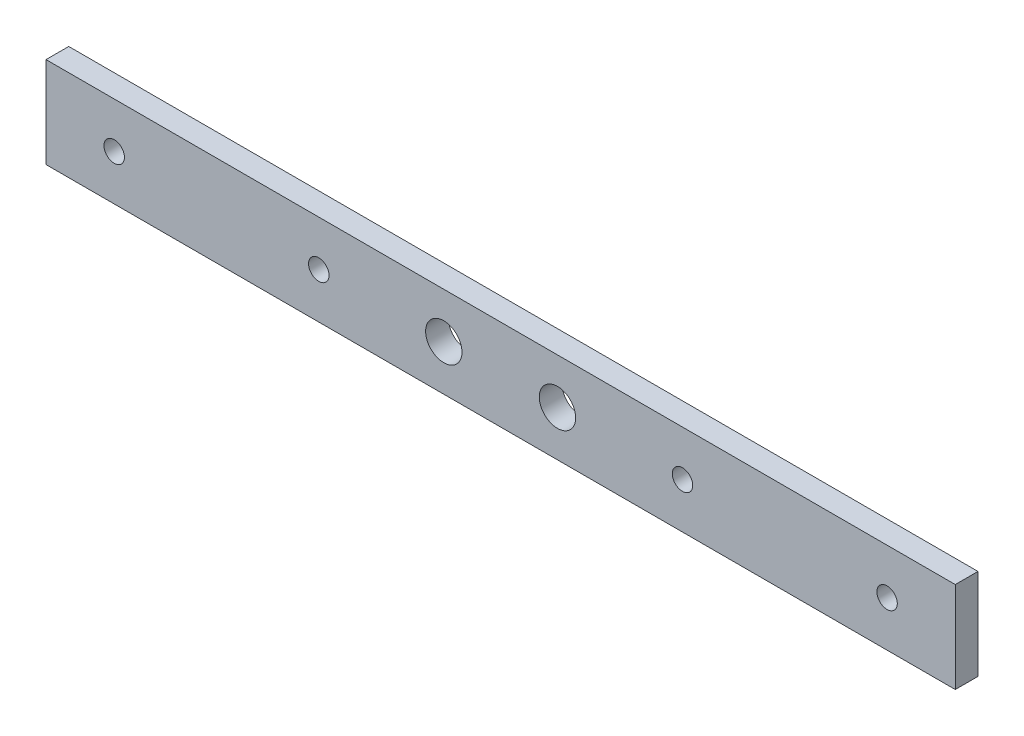
ISO-10303-21;
HEADER;
FILE_DESCRIPTION(('STEP AP214'),'2;1');
FILE_NAME('part.step','',(''),(''),'','','');
FILE_SCHEMA(('AUTOMOTIVE_DESIGN { 1 0 10303 214 1 1 1 1 }'));
ENDSEC;
DATA;
#1=APPLICATION_CONTEXT('core data for automotive mechanical design processes');
#2=APPLICATION_PROTOCOL_DEFINITION('international standard','automotive_design',2000,#1);
#3=PRODUCT_CONTEXT('',#1,'mechanical');
#4=PRODUCT('Part','Part','',(#3));
#5=PRODUCT_RELATED_PRODUCT_CATEGORY('part','',(#4));
#6=PRODUCT_DEFINITION_FORMATION('','',#4);
#7=PRODUCT_DEFINITION_CONTEXT('part definition',#1,'design');
#8=PRODUCT_DEFINITION('design','',#6,#7);
#9=PRODUCT_DEFINITION_SHAPE('','',#8);
#10=(LENGTH_UNIT() NAMED_UNIT(*) SI_UNIT(.MILLI.,.METRE.));
#11=(NAMED_UNIT(*) PLANE_ANGLE_UNIT() SI_UNIT($,.RADIAN.));
#12=(NAMED_UNIT(*) SI_UNIT($,.STERADIAN.) SOLID_ANGLE_UNIT());
#13=UNCERTAINTY_MEASURE_WITH_UNIT(LENGTH_MEASURE(1.E-05),#10,'distance_accuracy_value','');
#14=(GEOMETRIC_REPRESENTATION_CONTEXT(3) GLOBAL_UNCERTAINTY_ASSIGNED_CONTEXT((#13)) GLOBAL_UNIT_ASSIGNED_CONTEXT((#10,
#11,#12)) REPRESENTATION_CONTEXT('',''));
#15=CARTESIAN_POINT('',(0.,0.,0.));
#16=DIRECTION('',(0.,0.,1.));
#17=DIRECTION('',(1.,0.,0.));
#18=AXIS2_PLACEMENT_3D('',#15,#16,#17);
#19=CARTESIAN_POINT('',(0.,0.,5.));
#20=DIRECTION('',(0.,0.,-1.));
#21=DIRECTION('',(-1.,0.,0.));
#22=AXIS2_PLACEMENT_3D('',#19,#20,#21);
#23=PLANE('',#22);
#24=DIRECTION('',(0.,1.,0.));
#25=VECTOR('',#24,1.);
#26=CARTESIAN_POINT('',(100.,-10.,5.));
#27=LINE('',#26,#25);
#28=CARTESIAN_POINT('',(100.,-10.,5.));
#29=VERTEX_POINT('',#28);
#30=CARTESIAN_POINT('',(100.,10.,5.));
#31=VERTEX_POINT('',#30);
#32=EDGE_CURVE('E92',#29,#31,#27,.T.);
#33=ORIENTED_EDGE('',*,*,#32,.T.);
#34=DIRECTION('',(-1.,0.,0.));
#35=VECTOR('',#34,1.);
#36=CARTESIAN_POINT('',(-100.,10.,5.));
#37=LINE('',#36,#35);
#38=CARTESIAN_POINT('',(-100.,10.,5.));
#39=VERTEX_POINT('',#38);
#40=EDGE_CURVE('E87',#31,#39,#37,.T.);
#41=ORIENTED_EDGE('',*,*,#40,.T.);
#42=DIRECTION('',(0.,-1.,0.));
#43=VECTOR('',#42,1.);
#44=CARTESIAN_POINT('',(-100.,-10.,5.));
#45=LINE('',#44,#43);
#46=CARTESIAN_POINT('',(-100.,-10.,5.));
#47=VERTEX_POINT('',#46);
#48=EDGE_CURVE('E90',#39,#47,#45,.T.);
#49=ORIENTED_EDGE('',*,*,#48,.T.);
#50=DIRECTION('',(1.,0.,0.));
#51=VECTOR('',#50,1.);
#52=CARTESIAN_POINT('',(-100.,-10.,5.));
#53=LINE('',#52,#51);
#54=EDGE_CURVE('E57',#47,#29,#53,.T.);
#55=ORIENTED_EDGE('',*,*,#54,.T.);
#56=EDGE_LOOP('',(#33,#41,#49,#55));
#57=FACE_BOUND('',#56,.T.);
#58=CARTESIAN_POINT('',(-12.5,0.,5.));
#59=DIRECTION('',(0.,0.,1.));
#60=DIRECTION('',(1.,0.,0.));
#61=AXIS2_PLACEMENT_3D('',#58,#59,#60);
#62=CIRCLE('',#61,4.);
#63=CARTESIAN_POINT('',(-8.5,0.,5.));
#64=VERTEX_POINT('',#63);
#65=EDGE_CURVE('E112',#64,#64,#62,.T.);
#66=ORIENTED_EDGE('',*,*,#65,.F.);
#67=EDGE_LOOP('',(#66));
#68=FACE_BOUND('',#67,.T.);
#69=CARTESIAN_POINT('',(-85.,0.,5.));
#70=DIRECTION('',(0.,0.,1.));
#71=DIRECTION('',(1.,0.,0.));
#72=AXIS2_PLACEMENT_3D('',#69,#70,#71);
#73=CIRCLE('',#72,2.25);
#74=CARTESIAN_POINT('',(-82.75,0.,5.));
#75=VERTEX_POINT('',#74);
#76=EDGE_CURVE('E134',#75,#75,#73,.T.);
#77=ORIENTED_EDGE('',*,*,#76,.F.);
#78=EDGE_LOOP('',(#77));
#79=FACE_BOUND('',#78,.T.);
#80=CARTESIAN_POINT('',(-40.,0.,5.));
#81=DIRECTION('',(0.,0.,1.));
#82=DIRECTION('',(1.,0.,0.));
#83=AXIS2_PLACEMENT_3D('',#80,#81,#82);
#84=CIRCLE('',#83,2.25);
#85=CARTESIAN_POINT('',(-37.75,0.,5.));
#86=VERTEX_POINT('',#85);
#87=EDGE_CURVE('E142',#86,#86,#84,.T.);
#88=ORIENTED_EDGE('',*,*,#87,.F.);
#89=EDGE_LOOP('',(#88));
#90=FACE_BOUND('',#89,.T.);
#91=CARTESIAN_POINT('',(40.,0.,5.));
#92=DIRECTION('',(0.,0.,1.));
#93=DIRECTION('',(-1.,0.,0.));
#94=AXIS2_PLACEMENT_3D('',#91,#92,#93);
#95=CIRCLE('',#94,2.25);
#96=CARTESIAN_POINT('',(37.75,0.,5.));
#97=VERTEX_POINT('',#96);
#98=EDGE_CURVE('E150',#97,#97,#95,.T.);
#99=ORIENTED_EDGE('',*,*,#98,.F.);
#100=EDGE_LOOP('',(#99));
#101=FACE_BOUND('',#100,.T.);
#102=CARTESIAN_POINT('',(85.,0.,5.));
#103=DIRECTION('',(0.,0.,1.));
#104=DIRECTION('',(-1.,0.,0.));
#105=AXIS2_PLACEMENT_3D('',#102,#103,#104);
#106=CIRCLE('',#105,2.25000000000001);
#107=CARTESIAN_POINT('',(82.75,0.,5.));
#108=VERTEX_POINT('',#107);
#109=EDGE_CURVE('E158',#108,#108,#106,.T.);
#110=ORIENTED_EDGE('',*,*,#109,.F.);
#111=EDGE_LOOP('',(#110));
#112=FACE_BOUND('',#111,.T.);
#113=CARTESIAN_POINT('',(12.5,0.,5.));
#114=DIRECTION('',(0.,0.,1.));
#115=DIRECTION('',(-1.,0.,0.));
#116=AXIS2_PLACEMENT_3D('',#113,#114,#115);
#117=CIRCLE('',#116,4.);
#118=CARTESIAN_POINT('',(8.5,0.,5.));
#119=VERTEX_POINT('',#118);
#120=EDGE_CURVE('E166',#119,#119,#117,.T.);
#121=ORIENTED_EDGE('',*,*,#120,.F.);
#122=EDGE_LOOP('',(#121));
#123=FACE_BOUND('',#122,.T.);
#124=ADVANCED_FACE('F39',(#57,#68,#79,#90,#101,#112,#123),#23,.F.);
#125=CARTESIAN_POINT('',(0.,0.,0.));
#126=DIRECTION('',(0.,0.,-1.));
#127=DIRECTION('',(-1.,0.,0.));
#128=AXIS2_PLACEMENT_3D('',#125,#126,#127);
#129=PLANE('',#128);
#130=CARTESIAN_POINT('',(85.,0.,0.));
#131=DIRECTION('',(0.,0.,1.));
#132=DIRECTION('',(-1.,0.,0.));
#133=AXIS2_PLACEMENT_3D('',#130,#131,#132);
#134=CIRCLE('',#133,2.25000000000001);
#135=CARTESIAN_POINT('',(82.75,0.,0.));
#136=VERTEX_POINT('',#135);
#137=EDGE_CURVE('E162',#136,#136,#134,.T.);
#138=ORIENTED_EDGE('',*,*,#137,.T.);
#139=EDGE_LOOP('',(#138));
#140=FACE_BOUND('',#139,.T.);
#141=CARTESIAN_POINT('',(-40.,0.,0.));
#142=DIRECTION('',(0.,0.,1.));
#143=DIRECTION('',(1.,0.,0.));
#144=AXIS2_PLACEMENT_3D('',#141,#142,#143);
#145=CIRCLE('',#144,2.25);
#146=CARTESIAN_POINT('',(-37.75,0.,0.));
#147=VERTEX_POINT('',#146);
#148=EDGE_CURVE('E146',#147,#147,#145,.T.);
#149=ORIENTED_EDGE('',*,*,#148,.T.);
#150=EDGE_LOOP('',(#149));
#151=FACE_BOUND('',#150,.T.);
#152=CARTESIAN_POINT('',(-12.5,0.,0.));
#153=DIRECTION('',(0.,0.,1.));
#154=DIRECTION('',(1.,0.,0.));
#155=AXIS2_PLACEMENT_3D('',#152,#153,#154);
#156=CIRCLE('',#155,4.);
#157=CARTESIAN_POINT('',(-8.5,0.,0.));
#158=VERTEX_POINT('',#157);
#159=EDGE_CURVE('E130',#158,#158,#156,.T.);
#160=ORIENTED_EDGE('',*,*,#159,.T.);
#161=EDGE_LOOP('',(#160));
#162=FACE_BOUND('',#161,.T.);
#163=DIRECTION('',(0.,1.,0.));
#164=VECTOR('',#163,1.);
#165=CARTESIAN_POINT('',(100.,-10.,0.));
#166=LINE('',#165,#164);
#167=CARTESIAN_POINT('',(100.,-10.,0.));
#168=VERTEX_POINT('',#167);
#169=CARTESIAN_POINT('',(100.,10.,0.));
#170=VERTEX_POINT('',#169);
#171=EDGE_CURVE('E108',#168,#170,#166,.T.);
#172=ORIENTED_EDGE('',*,*,#171,.F.);
#173=DIRECTION('',(1.,0.,0.));
#174=VECTOR('',#173,1.);
#175=CARTESIAN_POINT('',(-100.,-10.,0.));
#176=LINE('',#175,#174);
#177=CARTESIAN_POINT('',(-100.,-10.,0.));
#178=VERTEX_POINT('',#177);
#179=EDGE_CURVE('E80',#178,#168,#176,.T.);
#180=ORIENTED_EDGE('',*,*,#179,.F.);
#181=DIRECTION('',(0.,-1.,0.));
#182=VECTOR('',#181,1.);
#183=CARTESIAN_POINT('',(-100.,-10.,0.));
#184=LINE('',#183,#182);
#185=CARTESIAN_POINT('',(-100.,10.,0.));
#186=VERTEX_POINT('',#185);
#187=EDGE_CURVE('E74',#186,#178,#184,.T.);
#188=ORIENTED_EDGE('',*,*,#187,.F.);
#189=DIRECTION('',(-1.,0.,0.));
#190=VECTOR('',#189,1.);
#191=CARTESIAN_POINT('',(-100.,10.,0.));
#192=LINE('',#191,#190);
#193=EDGE_CURVE('E97',#170,#186,#192,.T.);
#194=ORIENTED_EDGE('',*,*,#193,.F.);
#195=EDGE_LOOP('',(#172,#180,#188,#194));
#196=FACE_BOUND('',#195,.T.);
#197=CARTESIAN_POINT('',(-85.,0.,0.));
#198=DIRECTION('',(0.,0.,1.));
#199=DIRECTION('',(1.,0.,0.));
#200=AXIS2_PLACEMENT_3D('',#197,#198,#199);
#201=CIRCLE('',#200,2.25);
#202=CARTESIAN_POINT('',(-82.75,0.,0.));
#203=VERTEX_POINT('',#202);
#204=EDGE_CURVE('E138',#203,#203,#201,.T.);
#205=ORIENTED_EDGE('',*,*,#204,.T.);
#206=EDGE_LOOP('',(#205));
#207=FACE_BOUND('',#206,.T.);
#208=CARTESIAN_POINT('',(40.,0.,0.));
#209=DIRECTION('',(0.,0.,1.));
#210=DIRECTION('',(-1.,0.,0.));
#211=AXIS2_PLACEMENT_3D('',#208,#209,#210);
#212=CIRCLE('',#211,2.25);
#213=CARTESIAN_POINT('',(37.75,0.,0.));
#214=VERTEX_POINT('',#213);
#215=EDGE_CURVE('E154',#214,#214,#212,.T.);
#216=ORIENTED_EDGE('',*,*,#215,.T.);
#217=EDGE_LOOP('',(#216));
#218=FACE_BOUND('',#217,.T.);
#219=CARTESIAN_POINT('',(12.5,0.,0.));
#220=DIRECTION('',(0.,0.,1.));
#221=DIRECTION('',(-1.,0.,0.));
#222=AXIS2_PLACEMENT_3D('',#219,#220,#221);
#223=CIRCLE('',#222,4.);
#224=CARTESIAN_POINT('',(8.5,0.,0.));
#225=VERTEX_POINT('',#224);
#226=EDGE_CURVE('E170',#225,#225,#223,.T.);
#227=ORIENTED_EDGE('',*,*,#226,.T.);
#228=EDGE_LOOP('',(#227));
#229=FACE_BOUND('',#228,.T.);
#230=ADVANCED_FACE('F125',(#140,#151,#162,#196,#207,#218,#229),#129,.T.);
#231=CARTESIAN_POINT('',(100.,-10.,5.));
#232=DIRECTION('',(-1.,0.,0.));
#233=DIRECTION('',(0.,0.,1.));
#234=AXIS2_PLACEMENT_3D('',#231,#232,#233);
#235=PLANE('',#234);
#236=ORIENTED_EDGE('',*,*,#171,.T.);
#237=DIRECTION('',(0.,0.,-1.));
#238=VECTOR('',#237,1.);
#239=CARTESIAN_POINT('',(100.,10.,5.));
#240=LINE('',#239,#238);
#241=EDGE_CURVE('E11',#31,#170,#240,.T.);
#242=ORIENTED_EDGE('',*,*,#241,.F.);
#243=ORIENTED_EDGE('',*,*,#32,.F.);
#244=DIRECTION('',(0.,0.,-1.));
#245=VECTOR('',#244,1.);
#246=CARTESIAN_POINT('',(100.,-10.,5.));
#247=LINE('',#246,#245);
#248=EDGE_CURVE('E104',#29,#168,#247,.T.);
#249=ORIENTED_EDGE('',*,*,#248,.T.);
#250=EDGE_LOOP('',(#236,#242,#243,#249));
#251=FACE_BOUND('',#250,.T.);
#252=ADVANCED_FACE('F41',(#251),#235,.F.);
#253=CARTESIAN_POINT('',(-100.,10.,5.));
#254=DIRECTION('',(0.,-1.,0.));
#255=DIRECTION('',(0.,0.,-1.));
#256=AXIS2_PLACEMENT_3D('',#253,#254,#255);
#257=PLANE('',#256);
#258=ORIENTED_EDGE('',*,*,#193,.T.);
#259=DIRECTION('',(0.,0.,-1.));
#260=VECTOR('',#259,1.);
#261=CARTESIAN_POINT('',(-100.,10.,5.));
#262=LINE('',#261,#260);
#263=EDGE_CURVE('E49',#39,#186,#262,.T.);
#264=ORIENTED_EDGE('',*,*,#263,.F.);
#265=ORIENTED_EDGE('',*,*,#40,.F.);
#266=ORIENTED_EDGE('',*,*,#241,.T.);
#267=EDGE_LOOP('',(#258,#264,#265,#266));
#268=FACE_BOUND('',#267,.T.);
#269=ADVANCED_FACE('F96',(#268),#257,.F.);
#270=CARTESIAN_POINT('',(-100.,-10.,5.));
#271=DIRECTION('',(1.,0.,0.));
#272=DIRECTION('',(0.,0.,-1.));
#273=AXIS2_PLACEMENT_3D('',#270,#271,#272);
#274=PLANE('',#273);
#275=ORIENTED_EDGE('',*,*,#187,.T.);
#276=DIRECTION('',(0.,0.,-1.));
#277=VECTOR('',#276,1.);
#278=CARTESIAN_POINT('',(-100.,-10.,5.));
#279=LINE('',#278,#277);
#280=EDGE_CURVE('E99',#47,#178,#279,.T.);
#281=ORIENTED_EDGE('',*,*,#280,.F.);
#282=ORIENTED_EDGE('',*,*,#48,.F.);
#283=ORIENTED_EDGE('',*,*,#263,.T.);
#284=EDGE_LOOP('',(#275,#281,#282,#283));
#285=FACE_BOUND('',#284,.T.);
#286=ADVANCED_FACE('F100',(#285),#274,.F.);
#287=CARTESIAN_POINT('',(-100.,-10.,5.));
#288=DIRECTION('',(0.,1.,0.));
#289=DIRECTION('',(0.,0.,1.));
#290=AXIS2_PLACEMENT_3D('',#287,#288,#289);
#291=PLANE('',#290);
#292=ORIENTED_EDGE('',*,*,#179,.T.);
#293=ORIENTED_EDGE('',*,*,#248,.F.);
#294=ORIENTED_EDGE('',*,*,#54,.F.);
#295=ORIENTED_EDGE('',*,*,#280,.T.);
#296=EDGE_LOOP('',(#292,#293,#294,#295));
#297=FACE_BOUND('',#296,.T.);
#298=ADVANCED_FACE('F122',(#297),#291,.F.);
#299=CARTESIAN_POINT('',(-12.5,0.,5.));
#300=DIRECTION('',(0.,0.,-1.));
#301=DIRECTION('',(-1.,0.,0.));
#302=AXIS2_PLACEMENT_3D('',#299,#300,#301);
#303=CYLINDRICAL_SURFACE('',#302,4.);
#304=ORIENTED_EDGE('',*,*,#65,.T.);
#305=EDGE_LOOP('',(#304));
#306=FACE_BOUND('',#305,.T.);
#307=ORIENTED_EDGE('',*,*,#159,.F.);
#308=EDGE_LOOP('',(#307));
#309=FACE_BOUND('',#308,.T.);
#310=ADVANCED_FACE('F189',(#306,#309),#303,.F.);
#311=CARTESIAN_POINT('',(-85.,0.,5.));
#312=DIRECTION('',(0.,0.,-1.));
#313=DIRECTION('',(-1.,0.,0.));
#314=AXIS2_PLACEMENT_3D('',#311,#312,#313);
#315=CYLINDRICAL_SURFACE('',#314,2.25);
#316=ORIENTED_EDGE('',*,*,#76,.T.);
#317=EDGE_LOOP('',(#316));
#318=FACE_BOUND('',#317,.T.);
#319=ORIENTED_EDGE('',*,*,#204,.F.);
#320=EDGE_LOOP('',(#319));
#321=FACE_BOUND('',#320,.T.);
#322=ADVANCED_FACE('F235',(#318,#321),#315,.F.);
#323=CARTESIAN_POINT('',(-40.,0.,5.));
#324=DIRECTION('',(0.,0.,-1.));
#325=DIRECTION('',(-1.,0.,0.));
#326=AXIS2_PLACEMENT_3D('',#323,#324,#325);
#327=CYLINDRICAL_SURFACE('',#326,2.25);
#328=ORIENTED_EDGE('',*,*,#87,.T.);
#329=EDGE_LOOP('',(#328));
#330=FACE_BOUND('',#329,.T.);
#331=ORIENTED_EDGE('',*,*,#148,.F.);
#332=EDGE_LOOP('',(#331));
#333=FACE_BOUND('',#332,.T.);
#334=ADVANCED_FACE('F243',(#330,#333),#327,.F.);
#335=CARTESIAN_POINT('',(40.,0.,5.));
#336=DIRECTION('',(0.,0.,-1.));
#337=DIRECTION('',(-1.,0.,0.));
#338=AXIS2_PLACEMENT_3D('',#335,#336,#337);
#339=CYLINDRICAL_SURFACE('',#338,2.25);
#340=ORIENTED_EDGE('',*,*,#98,.T.);
#341=EDGE_LOOP('',(#340));
#342=FACE_BOUND('',#341,.T.);
#343=ORIENTED_EDGE('',*,*,#215,.F.);
#344=EDGE_LOOP('',(#343));
#345=FACE_BOUND('',#344,.T.);
#346=ADVANCED_FACE('F251',(#342,#345),#339,.F.);
#347=CARTESIAN_POINT('',(85.,0.,5.));
#348=DIRECTION('',(0.,0.,-1.));
#349=DIRECTION('',(-1.,0.,0.));
#350=AXIS2_PLACEMENT_3D('',#347,#348,#349);
#351=CYLINDRICAL_SURFACE('',#350,2.25000000000001);
#352=ORIENTED_EDGE('',*,*,#109,.T.);
#353=EDGE_LOOP('',(#352));
#354=FACE_BOUND('',#353,.T.);
#355=ORIENTED_EDGE('',*,*,#137,.F.);
#356=EDGE_LOOP('',(#355));
#357=FACE_BOUND('',#356,.T.);
#358=ADVANCED_FACE('F260',(#354,#357),#351,.F.);
#359=CARTESIAN_POINT('',(12.5,0.,5.));
#360=DIRECTION('',(0.,0.,-1.));
#361=DIRECTION('',(-1.,0.,0.));
#362=AXIS2_PLACEMENT_3D('',#359,#360,#361);
#363=CYLINDRICAL_SURFACE('',#362,4.);
#364=ORIENTED_EDGE('',*,*,#120,.T.);
#365=EDGE_LOOP('',(#364));
#366=FACE_BOUND('',#365,.T.);
#367=ORIENTED_EDGE('',*,*,#226,.F.);
#368=EDGE_LOOP('',(#367));
#369=FACE_BOUND('',#368,.T.);
#370=ADVANCED_FACE('F178',(#366,#369),#363,.F.);
#371=CLOSED_SHELL('',(#124,#230,#252,#269,#286,#298,#310,#322,#334,#346,#358,#370));
#372=MANIFOLD_SOLID_BREP('B2',#371);
#373=ADVANCED_BREP_SHAPE_REPRESENTATION('',(#18,#372),#14);
#374=SHAPE_DEFINITION_REPRESENTATION(#9,#373);
ENDSEC;
END-ISO-10303-21;
